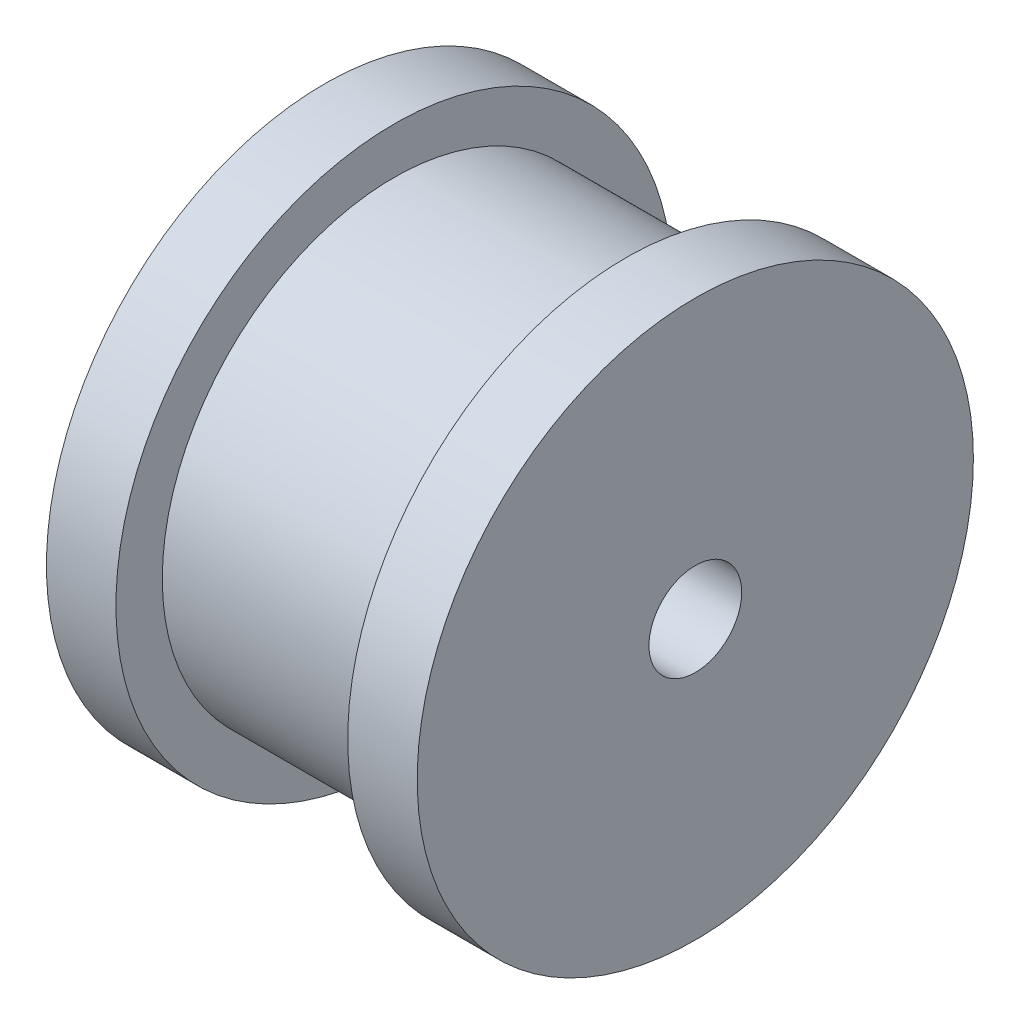
ISO-10303-21;
HEADER;
FILE_DESCRIPTION(('STEP AP214'),'2;1');
FILE_NAME('part.step','',(''),(''),'','','');
FILE_SCHEMA(('AUTOMOTIVE_DESIGN { 1 0 10303 214 1 1 1 1 }'));
ENDSEC;
DATA;
#1=APPLICATION_CONTEXT('core data for automotive mechanical design processes');
#2=APPLICATION_PROTOCOL_DEFINITION('international standard','automotive_design',2000,#1);
#3=PRODUCT_CONTEXT('',#1,'mechanical');
#4=PRODUCT('Part','Part','',(#3));
#5=PRODUCT_RELATED_PRODUCT_CATEGORY('part','',(#4));
#6=PRODUCT_DEFINITION_FORMATION('','',#4);
#7=PRODUCT_DEFINITION_CONTEXT('part definition',#1,'design');
#8=PRODUCT_DEFINITION('design','',#6,#7);
#9=PRODUCT_DEFINITION_SHAPE('','',#8);
#10=(LENGTH_UNIT() NAMED_UNIT(*) SI_UNIT(.MILLI.,.METRE.));
#11=(NAMED_UNIT(*) PLANE_ANGLE_UNIT() SI_UNIT($,.RADIAN.));
#12=(NAMED_UNIT(*) SI_UNIT($,.STERADIAN.) SOLID_ANGLE_UNIT());
#13=UNCERTAINTY_MEASURE_WITH_UNIT(LENGTH_MEASURE(1.E-05),#10,'distance_accuracy_value','');
#14=(GEOMETRIC_REPRESENTATION_CONTEXT(3) GLOBAL_UNCERTAINTY_ASSIGNED_CONTEXT((#13)) GLOBAL_UNIT_ASSIGNED_CONTEXT((#10,
#11,#12)) REPRESENTATION_CONTEXT('',''));
#15=CARTESIAN_POINT('',(0.,0.,0.));
#16=DIRECTION('',(0.,0.,1.));
#17=DIRECTION('',(1.,0.,0.));
#18=AXIS2_PLACEMENT_3D('',#15,#16,#17);
#19=CARTESIAN_POINT('',(8.,0.,0.));
#20=DIRECTION('',(-1.,0.,0.));
#21=DIRECTION('',(0.,0.,1.));
#22=AXIS2_PLACEMENT_3D('',#19,#20,#21);
#23=CYLINDRICAL_SURFACE('',#22,12.);
#24=CARTESIAN_POINT('',(-8.,0.,0.));
#25=DIRECTION('',(1.,0.,0.));
#26=DIRECTION('',(0.,0.,-1.));
#27=AXIS2_PLACEMENT_3D('',#24,#25,#26);
#28=CIRCLE('',#27,12.);
#29=CARTESIAN_POINT('',(-8.,0.,-12.));
#30=VERTEX_POINT('',#29);
#31=EDGE_CURVE('E44',#30,#30,#28,.T.);
#32=ORIENTED_EDGE('',*,*,#31,.T.);
#33=EDGE_LOOP('',(#32));
#34=FACE_BOUND('',#33,.T.);
#35=CARTESIAN_POINT('',(-5.,0.,0.));
#36=DIRECTION('',(1.,0.,0.));
#37=DIRECTION('',(0.,0.,-1.));
#38=AXIS2_PLACEMENT_3D('',#35,#36,#37);
#39=CIRCLE('',#38,12.);
#40=CARTESIAN_POINT('',(-5.,0.,-12.));
#41=VERTEX_POINT('',#40);
#42=EDGE_CURVE('E53',#41,#41,#39,.T.);
#43=ORIENTED_EDGE('',*,*,#42,.F.);
#44=EDGE_LOOP('',(#43));
#45=FACE_BOUND('',#44,.T.);
#46=ADVANCED_FACE('F40',(#34,#45),#23,.T.);
#47=CARTESIAN_POINT('',(-8.,0.,0.));
#48=DIRECTION('',(1.,0.,0.));
#49=DIRECTION('',(0.,0.,-1.));
#50=AXIS2_PLACEMENT_3D('',#47,#48,#49);
#51=PLANE('',#50);
#52=CARTESIAN_POINT('',(-8.,0.,0.));
#53=DIRECTION('',(1.,0.,0.));
#54=DIRECTION('',(0.,0.,-1.));
#55=AXIS2_PLACEMENT_3D('',#52,#53,#54);
#56=CIRCLE('',#55,2.);
#57=CARTESIAN_POINT('',(-8.,0.,-2.));
#58=VERTEX_POINT('',#57);
#59=EDGE_CURVE('E67',#58,#58,#56,.T.);
#60=ORIENTED_EDGE('',*,*,#59,.T.);
#61=EDGE_LOOP('',(#60));
#62=FACE_BOUND('',#61,.T.);
#63=ORIENTED_EDGE('',*,*,#31,.F.);
#64=EDGE_LOOP('',(#63));
#65=FACE_BOUND('',#64,.T.);
#66=ADVANCED_FACE('F95',(#62,#65),#51,.F.);
#67=CARTESIAN_POINT('',(-5.,0.,0.));
#68=DIRECTION('',(1.,0.,0.));
#69=DIRECTION('',(0.,0.,-1.));
#70=AXIS2_PLACEMENT_3D('',#67,#68,#69);
#71=PLANE('',#70);
#72=CARTESIAN_POINT('',(-5.,0.,0.));
#73=DIRECTION('',(1.,0.,0.));
#74=DIRECTION('',(0.,0.,-1.));
#75=AXIS2_PLACEMENT_3D('',#72,#73,#74);
#76=CIRCLE('',#75,10.);
#77=CARTESIAN_POINT('',(-5.,0.,-10.));
#78=VERTEX_POINT('',#77);
#79=EDGE_CURVE('E59',#78,#78,#76,.T.);
#80=ORIENTED_EDGE('',*,*,#79,.F.);
#81=EDGE_LOOP('',(#80));
#82=FACE_BOUND('',#81,.T.);
#83=ORIENTED_EDGE('',*,*,#42,.T.);
#84=EDGE_LOOP('',(#83));
#85=FACE_BOUND('',#84,.T.);
#86=ADVANCED_FACE('F100',(#82,#85),#71,.T.);
#87=CARTESIAN_POINT('',(5.,0.,0.));
#88=DIRECTION('',(1.,0.,0.));
#89=DIRECTION('',(0.,0.,-1.));
#90=AXIS2_PLACEMENT_3D('',#87,#88,#89);
#91=PLANE('',#90);
#92=CARTESIAN_POINT('',(5.,0.,0.));
#93=DIRECTION('',(1.,0.,0.));
#94=DIRECTION('',(0.,0.,-1.));
#95=AXIS2_PLACEMENT_3D('',#92,#93,#94);
#96=CIRCLE('',#95,10.);
#97=CARTESIAN_POINT('',(5.,0.,-10.));
#98=VERTEX_POINT('',#97);
#99=EDGE_CURVE('E63',#98,#98,#96,.T.);
#100=ORIENTED_EDGE('',*,*,#99,.T.);
#101=EDGE_LOOP('',(#100));
#102=FACE_BOUND('',#101,.T.);
#103=CARTESIAN_POINT('',(5.,0.,0.));
#104=DIRECTION('',(1.,0.,0.));
#105=DIRECTION('',(0.,0.,-1.));
#106=AXIS2_PLACEMENT_3D('',#103,#104,#105);
#107=CIRCLE('',#106,12.);
#108=CARTESIAN_POINT('',(5.,0.,-12.));
#109=VERTEX_POINT('',#108);
#110=EDGE_CURVE('E55',#109,#109,#107,.T.);
#111=ORIENTED_EDGE('',*,*,#110,.F.);
#112=EDGE_LOOP('',(#111));
#113=FACE_BOUND('',#112,.T.);
#114=ADVANCED_FACE('F90',(#102,#113),#91,.F.);
#115=CARTESIAN_POINT('',(-5.,0.,0.));
#116=DIRECTION('',(1.,0.,0.));
#117=DIRECTION('',(0.,0.,-1.));
#118=AXIS2_PLACEMENT_3D('',#115,#116,#117);
#119=CYLINDRICAL_SURFACE('',#118,10.);
#120=ORIENTED_EDGE('',*,*,#79,.T.);
#121=EDGE_LOOP('',(#120));
#122=FACE_BOUND('',#121,.T.);
#123=ORIENTED_EDGE('',*,*,#99,.F.);
#124=EDGE_LOOP('',(#123));
#125=FACE_BOUND('',#124,.T.);
#126=ADVANCED_FACE('F83',(#122,#125),#119,.T.);
#127=CARTESIAN_POINT('',(8.,0.,0.));
#128=DIRECTION('',(1.,0.,0.));
#129=DIRECTION('',(0.,0.,-1.));
#130=AXIS2_PLACEMENT_3D('',#127,#128,#129);
#131=PLANE('',#130);
#132=CARTESIAN_POINT('',(8.,0.,0.));
#133=DIRECTION('',(1.,0.,0.));
#134=DIRECTION('',(0.,0.,-1.));
#135=AXIS2_PLACEMENT_3D('',#132,#133,#134);
#136=CIRCLE('',#135,2.);
#137=CARTESIAN_POINT('',(8.,0.,-2.));
#138=VERTEX_POINT('',#137);
#139=EDGE_CURVE('E74',#138,#138,#136,.T.);
#140=ORIENTED_EDGE('',*,*,#139,.F.);
#141=EDGE_LOOP('',(#140));
#142=FACE_BOUND('',#141,.T.);
#143=CARTESIAN_POINT('',(8.,0.,0.));
#144=DIRECTION('',(1.,0.,0.));
#145=DIRECTION('',(0.,0.,-1.));
#146=AXIS2_PLACEMENT_3D('',#143,#144,#145);
#147=CIRCLE('',#146,12.);
#148=CARTESIAN_POINT('',(8.,0.,-12.));
#149=VERTEX_POINT('',#148);
#150=EDGE_CURVE('E10',#149,#149,#147,.T.);
#151=ORIENTED_EDGE('',*,*,#150,.T.);
#152=EDGE_LOOP('',(#151));
#153=FACE_BOUND('',#152,.T.);
#154=ADVANCED_FACE('F81',(#142,#153),#131,.T.);
#155=ORIENTED_EDGE('',*,*,#110,.T.);
#156=EDGE_LOOP('',(#155));
#157=FACE_BOUND('',#156,.T.);
#158=ORIENTED_EDGE('',*,*,#150,.F.);
#159=EDGE_LOOP('',(#158));
#160=FACE_BOUND('',#159,.T.);
#161=ADVANCED_FACE('F42',(#157,#160),#23,.T.);
#162=CARTESIAN_POINT('',(-8.,0.,0.));
#163=DIRECTION('',(1.,0.,0.));
#164=DIRECTION('',(0.,0.,-1.));
#165=AXIS2_PLACEMENT_3D('',#162,#163,#164);
#166=CYLINDRICAL_SURFACE('',#165,2.);
#167=ORIENTED_EDGE('',*,*,#59,.F.);
#168=EDGE_LOOP('',(#167));
#169=FACE_BOUND('',#168,.T.);
#170=ORIENTED_EDGE('',*,*,#139,.T.);
#171=EDGE_LOOP('',(#170));
#172=FACE_BOUND('',#171,.T.);
#173=ADVANCED_FACE('F79',(#169,#172),#166,.F.);
#174=CLOSED_SHELL('',(#46,#66,#86,#114,#126,#154,#161,#173));
#175=MANIFOLD_SOLID_BREP('B2',#174);
#176=ADVANCED_BREP_SHAPE_REPRESENTATION('',(#18,#175),#14);
#177=SHAPE_DEFINITION_REPRESENTATION(#9,#176);
ENDSEC;
END-ISO-10303-21;
